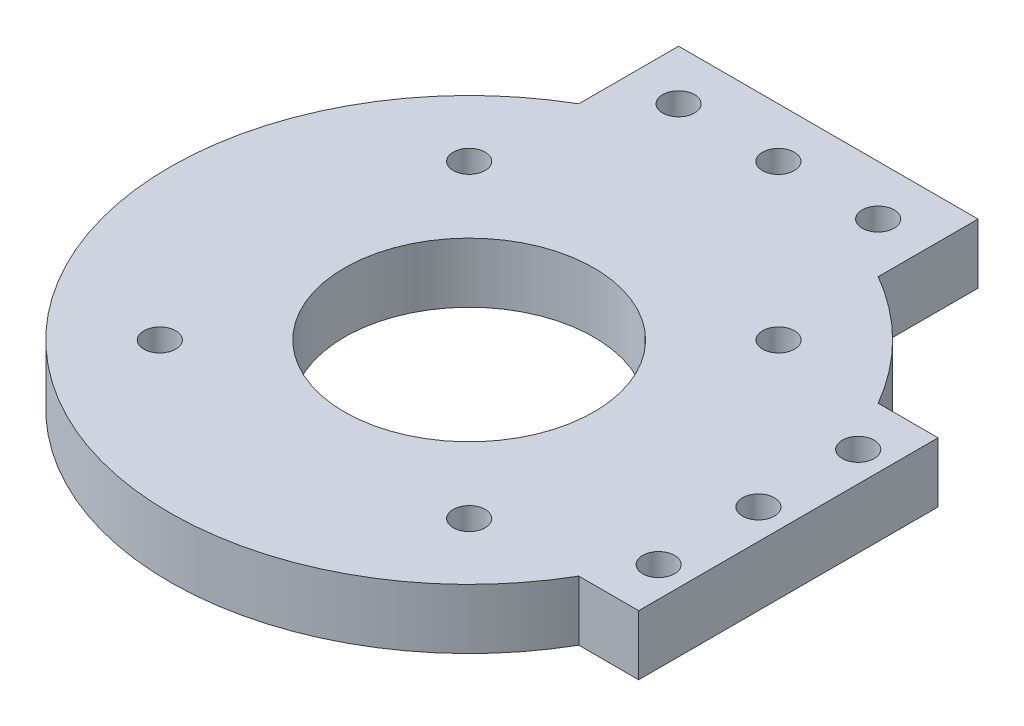
ISO-10303-21;
HEADER;
FILE_DESCRIPTION(('STEP AP214'),'2;1');
FILE_NAME('part.step','',(''),(''),'','','');
FILE_SCHEMA(('AUTOMOTIVE_DESIGN { 1 0 10303 214 1 1 1 1 }'));
ENDSEC;
DATA;
#1=APPLICATION_CONTEXT('core data for automotive mechanical design processes');
#2=APPLICATION_PROTOCOL_DEFINITION('international standard','automotive_design',2000,#1);
#3=PRODUCT_CONTEXT('',#1,'mechanical');
#4=PRODUCT('Part','Part','',(#3));
#5=PRODUCT_RELATED_PRODUCT_CATEGORY('part','',(#4));
#6=PRODUCT_DEFINITION_FORMATION('','',#4);
#7=PRODUCT_DEFINITION_CONTEXT('part definition',#1,'design');
#8=PRODUCT_DEFINITION('design','',#6,#7);
#9=PRODUCT_DEFINITION_SHAPE('','',#8);
#10=(LENGTH_UNIT() NAMED_UNIT(*) SI_UNIT(.MILLI.,.METRE.));
#11=(NAMED_UNIT(*) PLANE_ANGLE_UNIT() SI_UNIT($,.RADIAN.));
#12=(NAMED_UNIT(*) SI_UNIT($,.STERADIAN.) SOLID_ANGLE_UNIT());
#13=UNCERTAINTY_MEASURE_WITH_UNIT(LENGTH_MEASURE(1.E-05),#10,'distance_accuracy_value','');
#14=(GEOMETRIC_REPRESENTATION_CONTEXT(3) GLOBAL_UNCERTAINTY_ASSIGNED_CONTEXT((#13)) GLOBAL_UNIT_ASSIGNED_CONTEXT((#10,
#11,#12)) REPRESENTATION_CONTEXT('',''));
#15=CARTESIAN_POINT('',(0.,0.,0.));
#16=DIRECTION('',(0.,0.,1.));
#17=DIRECTION('',(1.,0.,0.));
#18=AXIS2_PLACEMENT_3D('',#15,#16,#17);
#19=CARTESIAN_POINT('',(0.,6.,0.));
#20=DIRECTION('',(0.,-1.,0.));
#21=DIRECTION('',(0.,0.,-1.));
#22=AXIS2_PLACEMENT_3D('',#19,#20,#21);
#23=CYLINDRICAL_SURFACE('',#22,30.);
#24=CARTESIAN_POINT('',(0.,0.,0.));
#25=DIRECTION('',(0.,1.,0.));
#26=DIRECTION('',(0.,0.,1.));
#27=AXIS2_PLACEMENT_3D('',#24,#25,#26);
#28=CIRCLE('',#27,30.);
#29=CARTESIAN_POINT('',(-15.,0.,-25.9807621135332));
#30=VERTEX_POINT('',#29);
#31=CARTESIAN_POINT('',(25.9807621135332,0.,15.));
#32=VERTEX_POINT('',#31);
#33=EDGE_CURVE('E137',#30,#32,#28,.T.);
#34=ORIENTED_EDGE('',*,*,#33,.T.);
#35=DIRECTION('',(0.,-1.,0.));
#36=VECTOR('',#35,1.);
#37=CARTESIAN_POINT('',(25.9807621135332,6.,15.));
#38=LINE('',#37,#36);
#39=CARTESIAN_POINT('',(25.9807621135332,6.,15.));
#40=VERTEX_POINT('',#39);
#41=EDGE_CURVE('E11',#40,#32,#38,.T.);
#42=ORIENTED_EDGE('',*,*,#41,.F.);
#43=CARTESIAN_POINT('',(0.,6.,0.));
#44=DIRECTION('',(0.,1.,0.));
#45=DIRECTION('',(0.,0.,1.));
#46=AXIS2_PLACEMENT_3D('',#43,#44,#45);
#47=CIRCLE('',#46,30.);
#48=CARTESIAN_POINT('',(-15.,6.,-25.9807621135332));
#49=VERTEX_POINT('',#48);
#50=EDGE_CURVE('E154',#49,#40,#47,.T.);
#51=ORIENTED_EDGE('',*,*,#50,.F.);
#52=DIRECTION('',(0.,-1.,0.));
#53=VECTOR('',#52,1.);
#54=CARTESIAN_POINT('',(-15.,6.,-25.9807621135332));
#55=LINE('',#54,#53);
#56=EDGE_CURVE('E133',#49,#30,#55,.T.);
#57=ORIENTED_EDGE('',*,*,#56,.T.);
#58=EDGE_LOOP('',(#34,#42,#51,#57));
#59=FACE_BOUND('',#58,.T.);
#60=ADVANCED_FACE('F40',(#59),#23,.T.);
#61=CARTESIAN_POINT('',(0.,6.,15.));
#62=DIRECTION('',(0.,0.,-1.));
#63=DIRECTION('',(-1.,0.,0.));
#64=AXIS2_PLACEMENT_3D('',#61,#62,#63);
#65=PLANE('',#64);
#66=DIRECTION('',(1.,0.,0.));
#67=VECTOR('',#66,1.);
#68=CARTESIAN_POINT('',(0.,0.,15.));
#69=LINE('',#68,#67);
#70=CARTESIAN_POINT('',(31.9807621135332,0.,15.));
#71=VERTEX_POINT('',#70);
#72=EDGE_CURVE('E140',#32,#71,#69,.T.);
#73=ORIENTED_EDGE('',*,*,#72,.T.);
#74=DIRECTION('',(0.,-1.,0.));
#75=VECTOR('',#74,1.);
#76=CARTESIAN_POINT('',(31.9807621135332,6.,15.));
#77=LINE('',#76,#75);
#78=CARTESIAN_POINT('',(31.9807621135332,6.,15.));
#79=VERTEX_POINT('',#78);
#80=EDGE_CURVE('E50',#79,#71,#77,.T.);
#81=ORIENTED_EDGE('',*,*,#80,.F.);
#82=DIRECTION('',(1.,0.,0.));
#83=VECTOR('',#82,1.);
#84=CARTESIAN_POINT('',(0.,6.,15.));
#85=LINE('',#84,#83);
#86=EDGE_CURVE('E97',#40,#79,#85,.T.);
#87=ORIENTED_EDGE('',*,*,#86,.F.);
#88=ORIENTED_EDGE('',*,*,#41,.T.);
#89=EDGE_LOOP('',(#73,#81,#87,#88));
#90=FACE_BOUND('',#89,.T.);
#91=ADVANCED_FACE('F42',(#90),#65,.F.);
#92=CARTESIAN_POINT('',(31.9807621135332,6.,0.));
#93=DIRECTION('',(-1.,0.,0.));
#94=DIRECTION('',(0.,0.,1.));
#95=AXIS2_PLACEMENT_3D('',#92,#93,#94);
#96=PLANE('',#95);
#97=DIRECTION('',(0.,0.,-1.));
#98=VECTOR('',#97,1.);
#99=CARTESIAN_POINT('',(31.9807621135332,0.,0.));
#100=LINE('',#99,#98);
#101=CARTESIAN_POINT('',(31.9807621135332,0.,-15.));
#102=VERTEX_POINT('',#101);
#103=EDGE_CURVE('E144',#71,#102,#100,.T.);
#104=ORIENTED_EDGE('',*,*,#103,.T.);
#105=DIRECTION('',(0.,-1.,0.));
#106=VECTOR('',#105,1.);
#107=CARTESIAN_POINT('',(31.9807621135332,6.,-15.));
#108=LINE('',#107,#106);
#109=CARTESIAN_POINT('',(31.9807621135332,6.,-15.));
#110=VERTEX_POINT('',#109);
#111=EDGE_CURVE('E160',#110,#102,#108,.T.);
#112=ORIENTED_EDGE('',*,*,#111,.F.);
#113=DIRECTION('',(0.,0.,-1.));
#114=VECTOR('',#113,1.);
#115=CARTESIAN_POINT('',(31.9807621135332,6.,0.));
#116=LINE('',#115,#114);
#117=EDGE_CURVE('E168',#79,#110,#116,.T.);
#118=ORIENTED_EDGE('',*,*,#117,.F.);
#119=ORIENTED_EDGE('',*,*,#80,.T.);
#120=EDGE_LOOP('',(#104,#112,#118,#119));
#121=FACE_BOUND('',#120,.T.);
#122=ADVANCED_FACE('F166',(#121),#96,.F.);
#123=CARTESIAN_POINT('',(0.,6.,-15.));
#124=DIRECTION('',(0.,0.,-1.));
#125=DIRECTION('',(-1.,0.,0.));
#126=AXIS2_PLACEMENT_3D('',#123,#124,#125);
#127=PLANE('',#126);
#128=DIRECTION('',(1.,0.,0.));
#129=VECTOR('',#128,1.);
#130=CARTESIAN_POINT('',(0.,0.,-15.));
#131=LINE('',#130,#129);
#132=CARTESIAN_POINT('',(25.9807621135332,0.,-15.));
#133=VERTEX_POINT('',#132);
#134=EDGE_CURVE('E147',#133,#102,#131,.T.);
#135=ORIENTED_EDGE('',*,*,#134,.F.);
#136=DIRECTION('',(0.,-1.,0.));
#137=VECTOR('',#136,1.);
#138=CARTESIAN_POINT('',(25.9807621135332,6.,-15.));
#139=LINE('',#138,#137);
#140=CARTESIAN_POINT('',(25.9807621135332,6.,-15.));
#141=VERTEX_POINT('',#140);
#142=EDGE_CURVE('E158',#141,#133,#139,.T.);
#143=ORIENTED_EDGE('',*,*,#142,.F.);
#144=DIRECTION('',(1.,0.,0.));
#145=VECTOR('',#144,1.);
#146=CARTESIAN_POINT('',(0.,6.,-15.));
#147=LINE('',#146,#145);
#148=EDGE_CURVE('E178',#141,#110,#147,.T.);
#149=ORIENTED_EDGE('',*,*,#148,.T.);
#150=ORIENTED_EDGE('',*,*,#111,.T.);
#151=EDGE_LOOP('',(#135,#143,#149,#150));
#152=FACE_BOUND('',#151,.T.);
#153=ADVANCED_FACE('F176',(#152),#127,.T.);
#154=CARTESIAN_POINT('',(15.,0.,-25.9807621135332));
#155=VERTEX_POINT('',#154);
#156=EDGE_CURVE('E142',#133,#155,#28,.T.);
#157=ORIENTED_EDGE('',*,*,#156,.T.);
#158=DIRECTION('',(0.,-1.,0.));
#159=VECTOR('',#158,1.);
#160=CARTESIAN_POINT('',(15.,6.,-25.9807621135332));
#161=LINE('',#160,#159);
#162=CARTESIAN_POINT('',(15.,6.,-25.9807621135332));
#163=VERTEX_POINT('',#162);
#164=EDGE_CURVE('E122',#163,#155,#161,.T.);
#165=ORIENTED_EDGE('',*,*,#164,.F.);
#166=EDGE_CURVE('E128',#141,#163,#47,.T.);
#167=ORIENTED_EDGE('',*,*,#166,.F.);
#168=ORIENTED_EDGE('',*,*,#142,.T.);
#169=EDGE_LOOP('',(#157,#165,#167,#168));
#170=FACE_BOUND('',#169,.T.);
#171=ADVANCED_FACE('F265',(#170),#23,.T.);
#172=CARTESIAN_POINT('',(15.,6.,0.));
#173=DIRECTION('',(1.,0.,0.));
#174=DIRECTION('',(0.,0.,-1.));
#175=AXIS2_PLACEMENT_3D('',#172,#173,#174);
#176=PLANE('',#175);
#177=DIRECTION('',(0.,0.,1.));
#178=VECTOR('',#177,1.);
#179=CARTESIAN_POINT('',(15.,0.,0.));
#180=LINE('',#179,#178);
#181=CARTESIAN_POINT('',(15.,0.,-35.9807621135332));
#182=VERTEX_POINT('',#181);
#183=EDGE_CURVE('E117',#182,#155,#180,.T.);
#184=ORIENTED_EDGE('',*,*,#183,.F.);
#185=DIRECTION('',(0.,-1.,0.));
#186=VECTOR('',#185,1.);
#187=CARTESIAN_POINT('',(15.,6.,-35.9807621135332));
#188=LINE('',#187,#186);
#189=CARTESIAN_POINT('',(15.,6.,-35.9807621135332));
#190=VERTEX_POINT('',#189);
#191=EDGE_CURVE('E112',#190,#182,#188,.T.);
#192=ORIENTED_EDGE('',*,*,#191,.F.);
#193=DIRECTION('',(0.,0.,1.));
#194=VECTOR('',#193,1.);
#195=CARTESIAN_POINT('',(15.,6.,0.));
#196=LINE('',#195,#194);
#197=EDGE_CURVE('E115',#190,#163,#196,.T.);
#198=ORIENTED_EDGE('',*,*,#197,.T.);
#199=ORIENTED_EDGE('',*,*,#164,.T.);
#200=EDGE_LOOP('',(#184,#192,#198,#199));
#201=FACE_BOUND('',#200,.T.);
#202=ADVANCED_FACE('F114',(#201),#176,.T.);
#203=CARTESIAN_POINT('',(0.,6.,-35.9807621135332));
#204=DIRECTION('',(0.,0.,-1.));
#205=DIRECTION('',(-1.,0.,0.));
#206=AXIS2_PLACEMENT_3D('',#203,#204,#205);
#207=PLANE('',#206);
#208=DIRECTION('',(1.,0.,0.));
#209=VECTOR('',#208,1.);
#210=CARTESIAN_POINT('',(0.,0.,-35.9807621135332));
#211=LINE('',#210,#209);
#212=CARTESIAN_POINT('',(-15.,0.,-35.9807621135332));
#213=VERTEX_POINT('',#212);
#214=EDGE_CURVE('E151',#213,#182,#211,.T.);
#215=ORIENTED_EDGE('',*,*,#214,.F.);
#216=DIRECTION('',(0.,-1.,0.));
#217=VECTOR('',#216,1.);
#218=CARTESIAN_POINT('',(-15.,6.,-35.9807621135332));
#219=LINE('',#218,#217);
#220=CARTESIAN_POINT('',(-15.,6.,-35.9807621135332));
#221=VERTEX_POINT('',#220);
#222=EDGE_CURVE('E86',#221,#213,#219,.T.);
#223=ORIENTED_EDGE('',*,*,#222,.F.);
#224=DIRECTION('',(1.,0.,0.));
#225=VECTOR('',#224,1.);
#226=CARTESIAN_POINT('',(0.,6.,-35.9807621135332));
#227=LINE('',#226,#225);
#228=EDGE_CURVE('E125',#221,#190,#227,.T.);
#229=ORIENTED_EDGE('',*,*,#228,.T.);
#230=ORIENTED_EDGE('',*,*,#191,.T.);
#231=EDGE_LOOP('',(#215,#223,#229,#230));
#232=FACE_BOUND('',#231,.T.);
#233=ADVANCED_FACE('F131',(#232),#207,.T.);
#234=CARTESIAN_POINT('',(-15.,6.,0.));
#235=DIRECTION('',(1.,0.,0.));
#236=DIRECTION('',(0.,0.,-1.));
#237=AXIS2_PLACEMENT_3D('',#234,#235,#236);
#238=PLANE('',#237);
#239=DIRECTION('',(0.,0.,1.));
#240=VECTOR('',#239,1.);
#241=CARTESIAN_POINT('',(-15.,0.,0.));
#242=LINE('',#241,#240);
#243=EDGE_CURVE('E89',#213,#30,#242,.T.);
#244=ORIENTED_EDGE('',*,*,#243,.T.);
#245=ORIENTED_EDGE('',*,*,#56,.F.);
#246=DIRECTION('',(0.,0.,1.));
#247=VECTOR('',#246,1.);
#248=CARTESIAN_POINT('',(-15.,6.,0.));
#249=LINE('',#248,#247);
#250=EDGE_CURVE('E58',#221,#49,#249,.T.);
#251=ORIENTED_EDGE('',*,*,#250,.F.);
#252=ORIENTED_EDGE('',*,*,#222,.T.);
#253=EDGE_LOOP('',(#244,#245,#251,#252));
#254=FACE_BOUND('',#253,.T.);
#255=ADVANCED_FACE('F279',(#254),#238,.F.);
#256=CARTESIAN_POINT('',(0.,6.,0.));
#257=DIRECTION('',(0.,1.,0.));
#258=DIRECTION('',(0.,0.,1.));
#259=AXIS2_PLACEMENT_3D('',#256,#257,#258);
#260=PLANE('',#259);
#261=CARTESIAN_POINT('',(0.,6.,0.));
#262=DIRECTION('',(0.,1.,0.));
#263=DIRECTION('',(0.,0.,1.));
#264=AXIS2_PLACEMENT_3D('',#261,#262,#263);
#265=CIRCLE('',#264,12.5);
#266=CARTESIAN_POINT('',(0.,6.,12.5));
#267=VERTEX_POINT('',#266);
#268=EDGE_CURVE('E242',#267,#267,#265,.T.);
#269=ORIENTED_EDGE('',*,*,#268,.F.);
#270=EDGE_LOOP('',(#269));
#271=FACE_BOUND('',#270,.T.);
#272=CARTESIAN_POINT('',(0.,6.,-30.9807621135332));
#273=DIRECTION('',(0.,1.,0.));
#274=DIRECTION('',(0.,0.,1.));
#275=AXIS2_PLACEMENT_3D('',#272,#273,#274);
#276=CIRCLE('',#275,1.6);
#277=CARTESIAN_POINT('',(0.,6.,-29.3807621135332));
#278=VERTEX_POINT('',#277);
#279=EDGE_CURVE('E216',#278,#278,#276,.T.);
#280=ORIENTED_EDGE('',*,*,#279,.F.);
#281=EDGE_LOOP('',(#280));
#282=FACE_BOUND('',#281,.T.);
#283=CARTESIAN_POINT('',(-9.99999999999999,6.,-30.9807621135332));
#284=DIRECTION('',(0.,1.,0.));
#285=DIRECTION('',(0.,0.,1.));
#286=AXIS2_PLACEMENT_3D('',#283,#284,#285);
#287=CIRCLE('',#286,1.6);
#288=CARTESIAN_POINT('',(-9.99999999999999,6.,-29.3807621135332));
#289=VERTEX_POINT('',#288);
#290=EDGE_CURVE('E223',#289,#289,#287,.T.);
#291=ORIENTED_EDGE('',*,*,#290,.F.);
#292=EDGE_LOOP('',(#291));
#293=FACE_BOUND('',#292,.T.);
#294=CARTESIAN_POINT('',(28.9807621135334,6.,10.));
#295=DIRECTION('',(0.,1.,0.));
#296=DIRECTION('',(0.,0.,1.));
#297=AXIS2_PLACEMENT_3D('',#294,#295,#296);
#298=CIRCLE('',#297,1.6);
#299=CARTESIAN_POINT('',(28.9807621135334,6.,11.6));
#300=VERTEX_POINT('',#299);
#301=EDGE_CURVE('E229',#300,#300,#298,.T.);
#302=ORIENTED_EDGE('',*,*,#301,.F.);
#303=EDGE_LOOP('',(#302));
#304=FACE_BOUND('',#303,.T.);
#305=CARTESIAN_POINT('',(28.9807621135333,6.,0.));
#306=DIRECTION('',(0.,1.,0.));
#307=DIRECTION('',(0.,0.,1.));
#308=AXIS2_PLACEMENT_3D('',#305,#306,#307);
#309=CIRCLE('',#308,1.6);
#310=CARTESIAN_POINT('',(28.9807621135333,6.,1.6));
#311=VERTEX_POINT('',#310);
#312=EDGE_CURVE('E193',#311,#311,#309,.T.);
#313=ORIENTED_EDGE('',*,*,#312,.F.);
#314=EDGE_LOOP('',(#313));
#315=FACE_BOUND('',#314,.T.);
#316=CARTESIAN_POINT('',(15.5,6.,15.5));
#317=DIRECTION('',(0.,1.,0.));
#318=DIRECTION('',(0.,0.,1.));
#319=AXIS2_PLACEMENT_3D('',#316,#317,#318);
#320=CIRCLE('',#319,1.6);
#321=CARTESIAN_POINT('',(15.5,6.,17.1));
#322=VERTEX_POINT('',#321);
#323=EDGE_CURVE('E192',#322,#322,#320,.T.);
#324=ORIENTED_EDGE('',*,*,#323,.F.);
#325=EDGE_LOOP('',(#324));
#326=FACE_BOUND('',#325,.T.);
#327=CARTESIAN_POINT('',(-15.5,6.,15.5));
#328=DIRECTION('',(0.,1.,0.));
#329=DIRECTION('',(0.,0.,1.));
#330=AXIS2_PLACEMENT_3D('',#327,#328,#329);
#331=CIRCLE('',#330,1.6);
#332=CARTESIAN_POINT('',(-15.5,6.,17.1));
#333=VERTEX_POINT('',#332);
#334=EDGE_CURVE('E199',#333,#333,#331,.T.);
#335=ORIENTED_EDGE('',*,*,#334,.F.);
#336=EDGE_LOOP('',(#335));
#337=FACE_BOUND('',#336,.T.);
#338=CARTESIAN_POINT('',(15.5,6.,-15.5));
#339=DIRECTION('',(0.,1.,0.));
#340=DIRECTION('',(0.,0.,1.));
#341=AXIS2_PLACEMENT_3D('',#338,#339,#340);
#342=CIRCLE('',#341,1.6);
#343=CARTESIAN_POINT('',(15.5,6.,-13.9));
#344=VERTEX_POINT('',#343);
#345=EDGE_CURVE('E205',#344,#344,#342,.T.);
#346=ORIENTED_EDGE('',*,*,#345,.F.);
#347=EDGE_LOOP('',(#346));
#348=FACE_BOUND('',#347,.T.);
#349=CARTESIAN_POINT('',(-15.5,6.,-15.5));
#350=DIRECTION('',(0.,1.,0.));
#351=DIRECTION('',(0.,0.,1.));
#352=AXIS2_PLACEMENT_3D('',#349,#350,#351);
#353=CIRCLE('',#352,1.6);
#354=CARTESIAN_POINT('',(-15.5,6.,-13.9));
#355=VERTEX_POINT('',#354);
#356=EDGE_CURVE('E186',#355,#355,#353,.T.);
#357=ORIENTED_EDGE('',*,*,#356,.F.);
#358=EDGE_LOOP('',(#357));
#359=FACE_BOUND('',#358,.T.);
#360=CARTESIAN_POINT('',(10.,6.,-30.9807621135332));
#361=DIRECTION('',(0.,1.,0.));
#362=DIRECTION('',(0.,0.,1.));
#363=AXIS2_PLACEMENT_3D('',#360,#361,#362);
#364=CIRCLE('',#363,1.6);
#365=CARTESIAN_POINT('',(10.,6.,-29.3807621135332));
#366=VERTEX_POINT('',#365);
#367=EDGE_CURVE('E217',#366,#366,#364,.T.);
#368=ORIENTED_EDGE('',*,*,#367,.F.);
#369=EDGE_LOOP('',(#368));
#370=FACE_BOUND('',#369,.T.);
#371=CARTESIAN_POINT('',(28.9807621135332,6.,-10.));
#372=DIRECTION('',(0.,1.,0.));
#373=DIRECTION('',(0.,0.,1.));
#374=AXIS2_PLACEMENT_3D('',#371,#372,#373);
#375=CIRCLE('',#374,1.6);
#376=CARTESIAN_POINT('',(28.9807621135332,6.,-8.4));
#377=VERTEX_POINT('',#376);
#378=EDGE_CURVE('E183',#377,#377,#375,.T.);
#379=ORIENTED_EDGE('',*,*,#378,.F.);
#380=EDGE_LOOP('',(#379));
#381=FACE_BOUND('',#380,.T.);
#382=ORIENTED_EDGE('',*,*,#50,.T.);
#383=ORIENTED_EDGE('',*,*,#86,.T.);
#384=ORIENTED_EDGE('',*,*,#117,.T.);
#385=ORIENTED_EDGE('',*,*,#148,.F.);
#386=ORIENTED_EDGE('',*,*,#166,.T.);
#387=ORIENTED_EDGE('',*,*,#197,.F.);
#388=ORIENTED_EDGE('',*,*,#228,.F.);
#389=ORIENTED_EDGE('',*,*,#250,.T.);
#390=EDGE_LOOP('',(#382,#383,#384,#385,#386,#387,#388,#389));
#391=FACE_BOUND('',#390,.T.);
#392=ADVANCED_FACE('F124',(#271,#282,#293,#304,#315,#326,#337,#348,#359,#370,#381,#391),#260,.T.);
#393=CARTESIAN_POINT('',(0.,0.,0.));
#394=DIRECTION('',(0.,1.,0.));
#395=DIRECTION('',(0.,0.,1.));
#396=AXIS2_PLACEMENT_3D('',#393,#394,#395);
#397=PLANE('',#396);
#398=CARTESIAN_POINT('',(0.,0.,0.));
#399=DIRECTION('',(0.,1.,0.));
#400=DIRECTION('',(0.,0.,1.));
#401=AXIS2_PLACEMENT_3D('',#398,#399,#400);
#402=CIRCLE('',#401,12.5);
#403=CARTESIAN_POINT('',(0.,0.,12.5));
#404=VERTEX_POINT('',#403);
#405=EDGE_CURVE('E44',#404,#404,#402,.T.);
#406=ORIENTED_EDGE('',*,*,#405,.T.);
#407=EDGE_LOOP('',(#406));
#408=FACE_BOUND('',#407,.T.);
#409=CARTESIAN_POINT('',(0.,0.,-30.9807621135332));
#410=DIRECTION('',(0.,1.,0.));
#411=DIRECTION('',(0.,0.,1.));
#412=AXIS2_PLACEMENT_3D('',#409,#410,#411);
#413=CIRCLE('',#412,1.6);
#414=CARTESIAN_POINT('',(0.,0.,-29.3807621135332));
#415=VERTEX_POINT('',#414);
#416=EDGE_CURVE('E213',#415,#415,#413,.T.);
#417=ORIENTED_EDGE('',*,*,#416,.T.);
#418=EDGE_LOOP('',(#417));
#419=FACE_BOUND('',#418,.T.);
#420=CARTESIAN_POINT('',(-9.99999999999999,0.,-30.9807621135332));
#421=DIRECTION('',(0.,1.,0.));
#422=DIRECTION('',(0.,0.,1.));
#423=AXIS2_PLACEMENT_3D('',#420,#421,#422);
#424=CIRCLE('',#423,1.6);
#425=CARTESIAN_POINT('',(-9.99999999999999,0.,-29.3807621135332));
#426=VERTEX_POINT('',#425);
#427=EDGE_CURVE('E220',#426,#426,#424,.T.);
#428=ORIENTED_EDGE('',*,*,#427,.T.);
#429=EDGE_LOOP('',(#428));
#430=FACE_BOUND('',#429,.T.);
#431=CARTESIAN_POINT('',(28.9807621135334,0.,10.));
#432=DIRECTION('',(0.,1.,0.));
#433=DIRECTION('',(0.,0.,1.));
#434=AXIS2_PLACEMENT_3D('',#431,#432,#433);
#435=CIRCLE('',#434,1.6);
#436=CARTESIAN_POINT('',(28.9807621135334,0.,11.6));
#437=VERTEX_POINT('',#436);
#438=EDGE_CURVE('E226',#437,#437,#435,.T.);
#439=ORIENTED_EDGE('',*,*,#438,.T.);
#440=EDGE_LOOP('',(#439));
#441=FACE_BOUND('',#440,.T.);
#442=CARTESIAN_POINT('',(28.9807621135333,0.,0.));
#443=DIRECTION('',(0.,1.,0.));
#444=DIRECTION('',(0.,0.,1.));
#445=AXIS2_PLACEMENT_3D('',#442,#443,#444);
#446=CIRCLE('',#445,1.6);
#447=CARTESIAN_POINT('',(28.9807621135333,0.,1.6));
#448=VERTEX_POINT('',#447);
#449=EDGE_CURVE('E232',#448,#448,#446,.T.);
#450=ORIENTED_EDGE('',*,*,#449,.T.);
#451=EDGE_LOOP('',(#450));
#452=FACE_BOUND('',#451,.T.);
#453=CARTESIAN_POINT('',(15.5,0.,15.5));
#454=DIRECTION('',(0.,1.,0.));
#455=DIRECTION('',(0.,0.,1.));
#456=AXIS2_PLACEMENT_3D('',#453,#454,#455);
#457=CIRCLE('',#456,1.6);
#458=CARTESIAN_POINT('',(15.5,0.,17.1));
#459=VERTEX_POINT('',#458);
#460=EDGE_CURVE('E189',#459,#459,#457,.T.);
#461=ORIENTED_EDGE('',*,*,#460,.T.);
#462=EDGE_LOOP('',(#461));
#463=FACE_BOUND('',#462,.T.);
#464=CARTESIAN_POINT('',(-15.5,0.,15.5));
#465=DIRECTION('',(0.,1.,0.));
#466=DIRECTION('',(0.,0.,1.));
#467=AXIS2_PLACEMENT_3D('',#464,#465,#466);
#468=CIRCLE('',#467,1.6);
#469=CARTESIAN_POINT('',(-15.5,0.,17.1));
#470=VERTEX_POINT('',#469);
#471=EDGE_CURVE('E196',#470,#470,#468,.T.);
#472=ORIENTED_EDGE('',*,*,#471,.T.);
#473=EDGE_LOOP('',(#472));
#474=FACE_BOUND('',#473,.T.);
#475=CARTESIAN_POINT('',(15.5,0.,-15.5));
#476=DIRECTION('',(0.,1.,0.));
#477=DIRECTION('',(0.,0.,1.));
#478=AXIS2_PLACEMENT_3D('',#475,#476,#477);
#479=CIRCLE('',#478,1.6);
#480=CARTESIAN_POINT('',(15.5,0.,-13.9));
#481=VERTEX_POINT('',#480);
#482=EDGE_CURVE('E202',#481,#481,#479,.T.);
#483=ORIENTED_EDGE('',*,*,#482,.T.);
#484=EDGE_LOOP('',(#483));
#485=FACE_BOUND('',#484,.T.);
#486=CARTESIAN_POINT('',(-15.5,0.,-15.5));
#487=DIRECTION('',(0.,1.,0.));
#488=DIRECTION('',(0.,0.,1.));
#489=AXIS2_PLACEMENT_3D('',#486,#487,#488);
#490=CIRCLE('',#489,1.6);
#491=CARTESIAN_POINT('',(-15.5,0.,-13.9));
#492=VERTEX_POINT('',#491);
#493=EDGE_CURVE('E208',#492,#492,#490,.T.);
#494=ORIENTED_EDGE('',*,*,#493,.T.);
#495=EDGE_LOOP('',(#494));
#496=FACE_BOUND('',#495,.T.);
#497=CARTESIAN_POINT('',(10.,0.,-30.9807621135332));
#498=DIRECTION('',(0.,1.,0.));
#499=DIRECTION('',(0.,0.,1.));
#500=AXIS2_PLACEMENT_3D('',#497,#498,#499);
#501=CIRCLE('',#500,1.6);
#502=CARTESIAN_POINT('',(10.,0.,-29.3807621135332));
#503=VERTEX_POINT('',#502);
#504=EDGE_CURVE('E237',#503,#503,#501,.T.);
#505=ORIENTED_EDGE('',*,*,#504,.T.);
#506=EDGE_LOOP('',(#505));
#507=FACE_BOUND('',#506,.T.);
#508=CARTESIAN_POINT('',(28.9807621135332,0.,-10.));
#509=DIRECTION('',(0.,1.,0.));
#510=DIRECTION('',(0.,0.,1.));
#511=AXIS2_PLACEMENT_3D('',#508,#509,#510);
#512=CIRCLE('',#511,1.6);
#513=CARTESIAN_POINT('',(28.9807621135332,0.,-8.4));
#514=VERTEX_POINT('',#513);
#515=EDGE_CURVE('E141',#514,#514,#512,.T.);
#516=ORIENTED_EDGE('',*,*,#515,.T.);
#517=EDGE_LOOP('',(#516));
#518=FACE_BOUND('',#517,.T.);
#519=ORIENTED_EDGE('',*,*,#33,.F.);
#520=ORIENTED_EDGE('',*,*,#243,.F.);
#521=ORIENTED_EDGE('',*,*,#214,.T.);
#522=ORIENTED_EDGE('',*,*,#183,.T.);
#523=ORIENTED_EDGE('',*,*,#156,.F.);
#524=ORIENTED_EDGE('',*,*,#134,.T.);
#525=ORIENTED_EDGE('',*,*,#103,.F.);
#526=ORIENTED_EDGE('',*,*,#72,.F.);
#527=EDGE_LOOP('',(#519,#520,#521,#522,#523,#524,#525,#526));
#528=FACE_BOUND('',#527,.T.);
#529=ADVANCED_FACE('F171',(#408,#419,#430,#441,#452,#463,#474,#485,#496,#507,#518,#528),#397,.F.);
#530=CARTESIAN_POINT('',(28.9807621135332,0.,-10.));
#531=DIRECTION('',(0.,1.,0.));
#532=DIRECTION('',(0.,0.,1.));
#533=AXIS2_PLACEMENT_3D('',#530,#531,#532);
#534=CYLINDRICAL_SURFACE('',#533,1.6);
#535=ORIENTED_EDGE('',*,*,#515,.F.);
#536=EDGE_LOOP('',(#535));
#537=FACE_BOUND('',#536,.T.);
#538=ORIENTED_EDGE('',*,*,#378,.T.);
#539=EDGE_LOOP('',(#538));
#540=FACE_BOUND('',#539,.T.);
#541=ADVANCED_FACE('F291',(#537,#540),#534,.F.);
#542=CARTESIAN_POINT('',(10.,0.,-30.9807621135332));
#543=DIRECTION('',(0.,1.,0.));
#544=DIRECTION('',(0.,0.,1.));
#545=AXIS2_PLACEMENT_3D('',#542,#543,#544);
#546=CYLINDRICAL_SURFACE('',#545,1.6);
#547=ORIENTED_EDGE('',*,*,#504,.F.);
#548=EDGE_LOOP('',(#547));
#549=FACE_BOUND('',#548,.T.);
#550=ORIENTED_EDGE('',*,*,#367,.T.);
#551=EDGE_LOOP('',(#550));
#552=FACE_BOUND('',#551,.T.);
#553=ADVANCED_FACE('F295',(#549,#552),#546,.F.);
#554=CARTESIAN_POINT('',(-15.5,0.,-15.5));
#555=DIRECTION('',(0.,1.,0.));
#556=DIRECTION('',(0.,0.,1.));
#557=AXIS2_PLACEMENT_3D('',#554,#555,#556);
#558=CYLINDRICAL_SURFACE('',#557,1.6);
#559=ORIENTED_EDGE('',*,*,#493,.F.);
#560=EDGE_LOOP('',(#559));
#561=FACE_BOUND('',#560,.T.);
#562=ORIENTED_EDGE('',*,*,#356,.T.);
#563=EDGE_LOOP('',(#562));
#564=FACE_BOUND('',#563,.T.);
#565=ADVANCED_FACE('F309',(#561,#564),#558,.F.);
#566=CARTESIAN_POINT('',(15.5,0.,-15.5));
#567=DIRECTION('',(0.,1.,0.));
#568=DIRECTION('',(0.,0.,1.));
#569=AXIS2_PLACEMENT_3D('',#566,#567,#568);
#570=CYLINDRICAL_SURFACE('',#569,1.6);
#571=ORIENTED_EDGE('',*,*,#482,.F.);
#572=EDGE_LOOP('',(#571));
#573=FACE_BOUND('',#572,.T.);
#574=ORIENTED_EDGE('',*,*,#345,.T.);
#575=EDGE_LOOP('',(#574));
#576=FACE_BOUND('',#575,.T.);
#577=ADVANCED_FACE('F305',(#573,#576),#570,.F.);
#578=CARTESIAN_POINT('',(-15.5,0.,15.5));
#579=DIRECTION('',(0.,1.,0.));
#580=DIRECTION('',(0.,0.,1.));
#581=AXIS2_PLACEMENT_3D('',#578,#579,#580);
#582=CYLINDRICAL_SURFACE('',#581,1.6);
#583=ORIENTED_EDGE('',*,*,#471,.F.);
#584=EDGE_LOOP('',(#583));
#585=FACE_BOUND('',#584,.T.);
#586=ORIENTED_EDGE('',*,*,#334,.T.);
#587=EDGE_LOOP('',(#586));
#588=FACE_BOUND('',#587,.T.);
#589=ADVANCED_FACE('F301',(#585,#588),#582,.F.);
#590=CARTESIAN_POINT('',(15.5,0.,15.5));
#591=DIRECTION('',(0.,1.,0.));
#592=DIRECTION('',(0.,0.,1.));
#593=AXIS2_PLACEMENT_3D('',#590,#591,#592);
#594=CYLINDRICAL_SURFACE('',#593,1.6);
#595=ORIENTED_EDGE('',*,*,#460,.F.);
#596=EDGE_LOOP('',(#595));
#597=FACE_BOUND('',#596,.T.);
#598=ORIENTED_EDGE('',*,*,#323,.T.);
#599=EDGE_LOOP('',(#598));
#600=FACE_BOUND('',#599,.T.);
#601=ADVANCED_FACE('F297',(#597,#600),#594,.F.);
#602=CARTESIAN_POINT('',(28.9807621135333,0.,0.));
#603=DIRECTION('',(0.,1.,0.));
#604=DIRECTION('',(0.,0.,1.));
#605=AXIS2_PLACEMENT_3D('',#602,#603,#604);
#606=CYLINDRICAL_SURFACE('',#605,1.6);
#607=ORIENTED_EDGE('',*,*,#449,.F.);
#608=EDGE_LOOP('',(#607));
#609=FACE_BOUND('',#608,.T.);
#610=ORIENTED_EDGE('',*,*,#312,.T.);
#611=EDGE_LOOP('',(#610));
#612=FACE_BOUND('',#611,.T.);
#613=ADVANCED_FACE('F300',(#609,#612),#606,.F.);
#614=CARTESIAN_POINT('',(28.9807621135334,0.,10.));
#615=DIRECTION('',(0.,1.,0.));
#616=DIRECTION('',(0.,0.,1.));
#617=AXIS2_PLACEMENT_3D('',#614,#615,#616);
#618=CYLINDRICAL_SURFACE('',#617,1.6);
#619=ORIENTED_EDGE('',*,*,#438,.F.);
#620=EDGE_LOOP('',(#619));
#621=FACE_BOUND('',#620,.T.);
#622=ORIENTED_EDGE('',*,*,#301,.T.);
#623=EDGE_LOOP('',(#622));
#624=FACE_BOUND('',#623,.T.);
#625=ADVANCED_FACE('F316',(#621,#624),#618,.F.);
#626=CARTESIAN_POINT('',(-9.99999999999999,0.,-30.9807621135332));
#627=DIRECTION('',(0.,1.,0.));
#628=DIRECTION('',(0.,0.,1.));
#629=AXIS2_PLACEMENT_3D('',#626,#627,#628);
#630=CYLINDRICAL_SURFACE('',#629,1.6);
#631=ORIENTED_EDGE('',*,*,#427,.F.);
#632=EDGE_LOOP('',(#631));
#633=FACE_BOUND('',#632,.T.);
#634=ORIENTED_EDGE('',*,*,#290,.T.);
#635=EDGE_LOOP('',(#634));
#636=FACE_BOUND('',#635,.T.);
#637=ADVANCED_FACE('F258',(#633,#636),#630,.F.);
#638=CARTESIAN_POINT('',(0.,0.,-30.9807621135332));
#639=DIRECTION('',(0.,1.,0.));
#640=DIRECTION('',(0.,0.,1.));
#641=AXIS2_PLACEMENT_3D('',#638,#639,#640);
#642=CYLINDRICAL_SURFACE('',#641,1.6);
#643=ORIENTED_EDGE('',*,*,#416,.F.);
#644=EDGE_LOOP('',(#643));
#645=FACE_BOUND('',#644,.T.);
#646=ORIENTED_EDGE('',*,*,#279,.T.);
#647=EDGE_LOOP('',(#646));
#648=FACE_BOUND('',#647,.T.);
#649=ADVANCED_FACE('F253',(#645,#648),#642,.F.);
#650=CARTESIAN_POINT('',(0.,-4.,0.));
#651=DIRECTION('',(0.,1.,0.));
#652=DIRECTION('',(0.,0.,1.));
#653=AXIS2_PLACEMENT_3D('',#650,#651,#652);
#654=CYLINDRICAL_SURFACE('',#653,12.5);
#655=ORIENTED_EDGE('',*,*,#268,.T.);
#656=EDGE_LOOP('',(#655));
#657=FACE_BOUND('',#656,.T.);
#658=ORIENTED_EDGE('',*,*,#405,.F.);
#659=EDGE_LOOP('',(#658));
#660=FACE_BOUND('',#659,.T.);
#661=ADVANCED_FACE('F251',(#657,#660),#654,.F.);
#662=CLOSED_SHELL('',(#60,#91,#122,#153,#171,#202,#233,#255,#392,#529,#541,#553,#565,#577,#589,
#601,#613,#625,#637,#649,#661));
#663=MANIFOLD_SOLID_BREP('B2',#662);
#664=ADVANCED_BREP_SHAPE_REPRESENTATION('',(#18,#663),#14);
#665=SHAPE_DEFINITION_REPRESENTATION(#9,#664);
ENDSEC;
END-ISO-10303-21;
